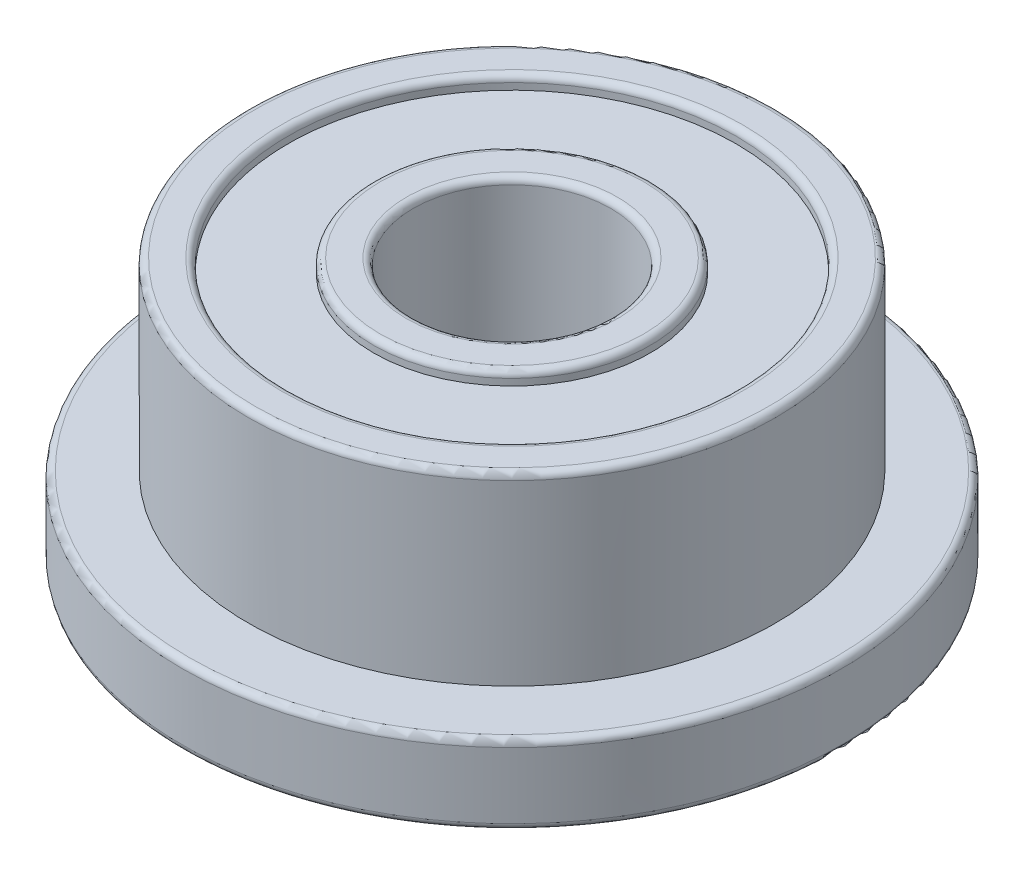
ISO-10303-21;
HEADER;
FILE_DESCRIPTION(('STEP AP214'),'2;1');
FILE_NAME('part.step','',(''),(''),'','','');
FILE_SCHEMA(('AUTOMOTIVE_DESIGN { 1 0 10303 214 1 1 1 1 }'));
ENDSEC;
DATA;
#1=APPLICATION_CONTEXT('core data for automotive mechanical design processes');
#2=APPLICATION_PROTOCOL_DEFINITION('international standard','automotive_design',2000,#1);
#3=PRODUCT_CONTEXT('',#1,'mechanical');
#4=PRODUCT('Part','Part','',(#3));
#5=PRODUCT_RELATED_PRODUCT_CATEGORY('part','',(#4));
#6=PRODUCT_DEFINITION_FORMATION('','',#4);
#7=PRODUCT_DEFINITION_CONTEXT('part definition',#1,'design');
#8=PRODUCT_DEFINITION('design','',#6,#7);
#9=PRODUCT_DEFINITION_SHAPE('','',#8);
#10=(LENGTH_UNIT() NAMED_UNIT(*) SI_UNIT(.MILLI.,.METRE.));
#11=(NAMED_UNIT(*) PLANE_ANGLE_UNIT() SI_UNIT($,.RADIAN.));
#12=(NAMED_UNIT(*) SI_UNIT($,.STERADIAN.) SOLID_ANGLE_UNIT());
#13=UNCERTAINTY_MEASURE_WITH_UNIT(LENGTH_MEASURE(1.E-05),#10,'distance_accuracy_value','');
#14=(GEOMETRIC_REPRESENTATION_CONTEXT(3) GLOBAL_UNCERTAINTY_ASSIGNED_CONTEXT((#13)) GLOBAL_UNIT_ASSIGNED_CONTEXT((#10,
#11,#12)) REPRESENTATION_CONTEXT('',''));
#15=CARTESIAN_POINT('',(0.,0.,0.));
#16=DIRECTION('',(0.,0.,1.));
#17=DIRECTION('',(1.,0.,0.));
#18=AXIS2_PLACEMENT_3D('',#15,#16,#17);
#19=CARTESIAN_POINT('',(0.,-1.1,0.));
#20=DIRECTION('',(0.,-1.,0.));
#21=DIRECTION('',(0.,0.,-1.));
#22=AXIS2_PLACEMENT_3D('',#19,#20,#21);
#23=CYLINDRICAL_SURFACE('',#22,1.05);
#24=CARTESIAN_POINT('',(0.,-0.9,0.));
#25=DIRECTION('',(0.,-1.,0.));
#26=DIRECTION('',(0.,0.,-1.));
#27=AXIS2_PLACEMENT_3D('',#24,#25,#26);
#28=CIRCLE('',#27,1.05);
#29=CARTESIAN_POINT('',(0.,-0.9,-1.05));
#30=VERTEX_POINT('',#29);
#31=EDGE_CURVE('E11',#30,#30,#28,.T.);
#32=ORIENTED_EDGE('',*,*,#31,.T.);
#33=EDGE_LOOP('',(#32));
#34=FACE_BOUND('',#33,.T.);
#35=CARTESIAN_POINT('',(0.,0.9,0.));
#36=DIRECTION('',(0.,-1.,0.));
#37=DIRECTION('',(0.,0.,-1.));
#38=AXIS2_PLACEMENT_3D('',#35,#36,#37);
#39=CIRCLE('',#38,1.05);
#40=CARTESIAN_POINT('',(0.,0.9,-1.05));
#41=VERTEX_POINT('',#40);
#42=EDGE_CURVE('E56',#41,#41,#39,.T.);
#43=ORIENTED_EDGE('',*,*,#42,.F.);
#44=EDGE_LOOP('',(#43));
#45=FACE_BOUND('',#44,.T.);
#46=ADVANCED_FACE('F42',(#34,#45),#23,.F.);
#47=CARTESIAN_POINT('',(1.05,-0.9,0.));
#48=DIRECTION('',(0.,-1.,0.));
#49=DIRECTION('',(0.,0.,-1.));
#50=AXIS2_PLACEMENT_3D('',#47,#48,#49);
#51=PLANE('',#50);
#52=CARTESIAN_POINT('',(0.,-0.9,0.));
#53=DIRECTION('',(0.,-1.,0.));
#54=DIRECTION('',(0.,0.,-1.));
#55=AXIS2_PLACEMENT_3D('',#52,#53,#54);
#56=CIRCLE('',#55,1.7);
#57=CARTESIAN_POINT('',(0.,-0.9,-1.7));
#58=VERTEX_POINT('',#57);
#59=EDGE_CURVE('E48',#58,#58,#56,.T.);
#60=ORIENTED_EDGE('',*,*,#59,.T.);
#61=EDGE_LOOP('',(#60));
#62=FACE_BOUND('',#61,.T.);
#63=ORIENTED_EDGE('',*,*,#31,.F.);
#64=EDGE_LOOP('',(#63));
#65=FACE_BOUND('',#64,.T.);
#66=ADVANCED_FACE('F66',(#62,#65),#51,.T.);
#67=CARTESIAN_POINT('',(0.,-1.1,0.));
#68=DIRECTION('',(0.,-1.,0.));
#69=DIRECTION('',(0.,0.,-1.));
#70=AXIS2_PLACEMENT_3D('',#67,#68,#69);
#71=CYLINDRICAL_SURFACE('',#70,1.7);
#72=CARTESIAN_POINT('',(0.,0.9,0.));
#73=DIRECTION('',(0.,-1.,0.));
#74=DIRECTION('',(0.,0.,-1.));
#75=AXIS2_PLACEMENT_3D('',#72,#73,#74);
#76=CIRCLE('',#75,1.7);
#77=CARTESIAN_POINT('',(0.,0.9,-1.7));
#78=VERTEX_POINT('',#77);
#79=EDGE_CURVE('E52',#78,#78,#76,.T.);
#80=ORIENTED_EDGE('',*,*,#79,.T.);
#81=EDGE_LOOP('',(#80));
#82=FACE_BOUND('',#81,.T.);
#83=ORIENTED_EDGE('',*,*,#59,.F.);
#84=EDGE_LOOP('',(#83));
#85=FACE_BOUND('',#84,.T.);
#86=ADVANCED_FACE('F70',(#82,#85),#71,.T.);
#87=CARTESIAN_POINT('',(1.05,0.9,0.));
#88=DIRECTION('',(0.,1.,0.));
#89=DIRECTION('',(0.,0.,1.));
#90=AXIS2_PLACEMENT_3D('',#87,#88,#89);
#91=PLANE('',#90);
#92=ORIENTED_EDGE('',*,*,#42,.T.);
#93=EDGE_LOOP('',(#92));
#94=FACE_BOUND('',#93,.T.);
#95=ORIENTED_EDGE('',*,*,#79,.F.);
#96=EDGE_LOOP('',(#95));
#97=FACE_BOUND('',#96,.T.);
#98=ADVANCED_FACE('F62',(#94,#97),#91,.T.);
#99=CLOSED_SHELL('',(#46,#66,#86,#98));
#100=MANIFOLD_SOLID_BREP('B2',#99);
#101=CARTESIAN_POINT('',(0.,-1.1,0.));
#102=DIRECTION('',(0.,-1.,0.));
#103=DIRECTION('',(0.,0.,-1.));
#104=AXIS2_PLACEMENT_3D('',#101,#102,#103);
#105=CYLINDRICAL_SURFACE('',#104,2.5);
#106=CARTESIAN_POINT('',(0.,-0.95,0.));
#107=DIRECTION('',(0.,-1.,0.));
#108=DIRECTION('',(0.,0.,-1.));
#109=AXIS2_PLACEMENT_3D('',#106,#107,#108);
#110=CIRCLE('',#109,2.5);
#111=CARTESIAN_POINT('',(0.,-0.95,-2.5));
#112=VERTEX_POINT('',#111);
#113=EDGE_CURVE('E137',#112,#112,#110,.F.);
#114=ORIENTED_EDGE('',*,*,#113,.T.);
#115=EDGE_LOOP('',(#114));
#116=FACE_BOUND('',#115,.T.);
#117=CARTESIAN_POINT('',(0.,-0.45,0.));
#118=DIRECTION('',(0.,1.,0.));
#119=DIRECTION('',(0.,0.,1.));
#120=AXIS2_PLACEMENT_3D('',#117,#118,#119);
#121=CIRCLE('',#120,2.5);
#122=CARTESIAN_POINT('',(0.,-0.45,2.5));
#123=VERTEX_POINT('',#122);
#124=EDGE_CURVE('E140',#123,#123,#121,.F.);
#125=ORIENTED_EDGE('',*,*,#124,.T.);
#126=EDGE_LOOP('',(#125));
#127=FACE_BOUND('',#126,.T.);
#128=ADVANCED_FACE('F111',(#116,#127),#105,.T.);
#129=CARTESIAN_POINT('',(2.5,-0.4,0.));
#130=DIRECTION('',(0.,1.,0.));
#131=DIRECTION('',(0.,0.,1.));
#132=AXIS2_PLACEMENT_3D('',#129,#130,#131);
#133=PLANE('',#132);
#134=CARTESIAN_POINT('',(0.,-0.4,0.));
#135=DIRECTION('',(0.,1.,0.));
#136=DIRECTION('',(0.,0.,1.));
#137=AXIS2_PLACEMENT_3D('',#134,#135,#136);
#138=CIRCLE('',#137,2.45);
#139=CARTESIAN_POINT('',(0.,-0.4,2.45));
#140=VERTEX_POINT('',#139);
#141=EDGE_CURVE('E134',#140,#140,#138,.T.);
#142=ORIENTED_EDGE('',*,*,#141,.T.);
#143=EDGE_LOOP('',(#142));
#144=FACE_BOUND('',#143,.T.);
#145=CARTESIAN_POINT('',(0.,-0.4,0.));
#146=DIRECTION('',(0.,-1.,0.));
#147=DIRECTION('',(0.,0.,-1.));
#148=AXIS2_PLACEMENT_3D('',#145,#146,#147);
#149=CIRCLE('',#148,2.);
#150=CARTESIAN_POINT('',(0.,-0.4,-2.));
#151=VERTEX_POINT('',#150);
#152=EDGE_CURVE('E149',#151,#151,#149,.T.);
#153=ORIENTED_EDGE('',*,*,#152,.T.);
#154=EDGE_LOOP('',(#153));
#155=FACE_BOUND('',#154,.T.);
#156=ADVANCED_FACE('F153',(#144,#155),#133,.T.);
#157=CARTESIAN_POINT('',(0.,-1.1,0.));
#158=DIRECTION('',(0.,-1.,0.));
#159=DIRECTION('',(0.,0.,-1.));
#160=AXIS2_PLACEMENT_3D('',#157,#158,#159);
#161=CYLINDRICAL_SURFACE('',#160,2.);
#162=CARTESIAN_POINT('',(0.,0.950000000000001,0.));
#163=DIRECTION('',(0.,1.,0.));
#164=DIRECTION('',(0.,0.,1.));
#165=AXIS2_PLACEMENT_3D('',#162,#163,#164);
#166=CIRCLE('',#165,2.);
#167=CARTESIAN_POINT('',(0.,0.950000000000001,2.));
#168=VERTEX_POINT('',#167);
#169=EDGE_CURVE('E41',#168,#168,#166,.F.);
#170=ORIENTED_EDGE('',*,*,#169,.T.);
#171=EDGE_LOOP('',(#170));
#172=FACE_BOUND('',#171,.T.);
#173=ORIENTED_EDGE('',*,*,#152,.F.);
#174=EDGE_LOOP('',(#173));
#175=FACE_BOUND('',#174,.T.);
#176=ADVANCED_FACE('F155',(#172,#175),#161,.T.);
#177=CARTESIAN_POINT('',(2.,1.,0.));
#178=DIRECTION('',(0.,1.,0.));
#179=DIRECTION('',(0.,0.,1.));
#180=AXIS2_PLACEMENT_3D('',#177,#178,#179);
#181=PLANE('',#180);
#182=CARTESIAN_POINT('',(0.,1.,0.));
#183=DIRECTION('',(0.,1.,0.));
#184=DIRECTION('',(0.,0.,1.));
#185=AXIS2_PLACEMENT_3D('',#182,#183,#184);
#186=CIRCLE('',#185,1.75);
#187=CARTESIAN_POINT('',(0.,1.,1.75));
#188=VERTEX_POINT('',#187);
#189=EDGE_CURVE('E118',#188,#188,#186,.F.);
#190=ORIENTED_EDGE('',*,*,#189,.T.);
#191=EDGE_LOOP('',(#190));
#192=FACE_BOUND('',#191,.T.);
#193=CARTESIAN_POINT('',(0.,1.,0.));
#194=DIRECTION('',(0.,1.,0.));
#195=DIRECTION('',(0.,0.,1.));
#196=AXIS2_PLACEMENT_3D('',#193,#194,#195);
#197=CIRCLE('',#196,1.95);
#198=CARTESIAN_POINT('',(0.,1.,1.95));
#199=VERTEX_POINT('',#198);
#200=EDGE_CURVE('E122',#199,#199,#197,.T.);
#201=ORIENTED_EDGE('',*,*,#200,.T.);
#202=EDGE_LOOP('',(#201));
#203=FACE_BOUND('',#202,.T.);
#204=ADVANCED_FACE('F157',(#192,#203),#181,.T.);
#205=CARTESIAN_POINT('',(0.,-1.1,0.));
#206=DIRECTION('',(0.,-1.,0.));
#207=DIRECTION('',(0.,0.,-1.));
#208=AXIS2_PLACEMENT_3D('',#205,#206,#207);
#209=CYLINDRICAL_SURFACE('',#208,1.7);
#210=CARTESIAN_POINT('',(0.,-0.95,0.));
#211=DIRECTION('',(0.,-1.,0.));
#212=DIRECTION('',(0.,0.,-1.));
#213=AXIS2_PLACEMENT_3D('',#210,#211,#212);
#214=CIRCLE('',#213,1.7);
#215=CARTESIAN_POINT('',(0.,-0.95,-1.7));
#216=VERTEX_POINT('',#215);
#217=EDGE_CURVE('E126',#216,#216,#214,.T.);
#218=ORIENTED_EDGE('',*,*,#217,.T.);
#219=EDGE_LOOP('',(#218));
#220=FACE_BOUND('',#219,.T.);
#221=CARTESIAN_POINT('',(0.,0.950000000000001,0.));
#222=DIRECTION('',(0.,1.,0.));
#223=DIRECTION('',(0.,0.,1.));
#224=AXIS2_PLACEMENT_3D('',#221,#222,#223);
#225=CIRCLE('',#224,1.7);
#226=CARTESIAN_POINT('',(0.,0.950000000000001,1.7));
#227=VERTEX_POINT('',#226);
#228=EDGE_CURVE('E131',#227,#227,#225,.T.);
#229=ORIENTED_EDGE('',*,*,#228,.T.);
#230=EDGE_LOOP('',(#229));
#231=FACE_BOUND('',#230,.T.);
#232=ADVANCED_FACE('F163',(#220,#231),#209,.F.);
#233=CARTESIAN_POINT('',(1.7,-1.,0.));
#234=DIRECTION('',(0.,-1.,0.));
#235=DIRECTION('',(0.,0.,-1.));
#236=AXIS2_PLACEMENT_3D('',#233,#234,#235);
#237=PLANE('',#236);
#238=CARTESIAN_POINT('',(0.,-1.,0.));
#239=DIRECTION('',(0.,-1.,0.));
#240=DIRECTION('',(0.,0.,-1.));
#241=AXIS2_PLACEMENT_3D('',#238,#239,#240);
#242=CIRCLE('',#241,2.45);
#243=CARTESIAN_POINT('',(0.,-1.,-2.45));
#244=VERTEX_POINT('',#243);
#245=EDGE_CURVE('E143',#244,#244,#242,.T.);
#246=ORIENTED_EDGE('',*,*,#245,.T.);
#247=EDGE_LOOP('',(#246));
#248=FACE_BOUND('',#247,.T.);
#249=CARTESIAN_POINT('',(0.,-1.,0.));
#250=DIRECTION('',(0.,-1.,0.));
#251=DIRECTION('',(0.,0.,-1.));
#252=AXIS2_PLACEMENT_3D('',#249,#250,#251);
#253=CIRCLE('',#252,1.75);
#254=CARTESIAN_POINT('',(0.,-1.,-1.75));
#255=VERTEX_POINT('',#254);
#256=EDGE_CURVE('E146',#255,#255,#253,.F.);
#257=ORIENTED_EDGE('',*,*,#256,.T.);
#258=EDGE_LOOP('',(#257));
#259=FACE_BOUND('',#258,.T.);
#260=ADVANCED_FACE('F178',(#248,#259),#237,.T.);
#261=CARTESIAN_POINT('',(0.,-0.95,0.));
#262=DIRECTION('',(0.,-1.,0.));
#263=DIRECTION('',(0.,0.,-1.));
#264=AXIS2_PLACEMENT_3D('',#261,#262,#263);
#265=TOROIDAL_SURFACE('',#264,2.45,0.05);
#266=ORIENTED_EDGE('',*,*,#113,.F.);
#267=EDGE_LOOP('',(#266));
#268=FACE_BOUND('',#267,.T.);
#269=ORIENTED_EDGE('',*,*,#245,.F.);
#270=EDGE_LOOP('',(#269));
#271=FACE_BOUND('',#270,.T.);
#272=ADVANCED_FACE('F174',(#268,#271),#265,.T.);
#273=CARTESIAN_POINT('',(0.,-0.45,0.));
#274=DIRECTION('',(0.,1.,0.));
#275=DIRECTION('',(0.,0.,1.));
#276=AXIS2_PLACEMENT_3D('',#273,#274,#275);
#277=TOROIDAL_SURFACE('',#276,2.45,0.05);
#278=ORIENTED_EDGE('',*,*,#141,.F.);
#279=EDGE_LOOP('',(#278));
#280=FACE_BOUND('',#279,.T.);
#281=ORIENTED_EDGE('',*,*,#124,.F.);
#282=EDGE_LOOP('',(#281));
#283=FACE_BOUND('',#282,.T.);
#284=ADVANCED_FACE('F177',(#280,#283),#277,.T.);
#285=CARTESIAN_POINT('',(0.,-0.95,0.));
#286=DIRECTION('',(0.,-1.,0.));
#287=DIRECTION('',(0.,0.,-1.));
#288=AXIS2_PLACEMENT_3D('',#285,#286,#287);
#289=TOROIDAL_SURFACE('',#288,1.75,0.05);
#290=ORIENTED_EDGE('',*,*,#256,.F.);
#291=EDGE_LOOP('',(#290));
#292=FACE_BOUND('',#291,.T.);
#293=ORIENTED_EDGE('',*,*,#217,.F.);
#294=EDGE_LOOP('',(#293));
#295=FACE_BOUND('',#294,.T.);
#296=ADVANCED_FACE('F182',(#292,#295),#289,.T.);
#297=CARTESIAN_POINT('',(0.,0.950000000000001,0.));
#298=DIRECTION('',(0.,1.,0.));
#299=DIRECTION('',(0.,0.,1.));
#300=AXIS2_PLACEMENT_3D('',#297,#298,#299);
#301=TOROIDAL_SURFACE('',#300,1.75,0.05);
#302=ORIENTED_EDGE('',*,*,#228,.F.);
#303=EDGE_LOOP('',(#302));
#304=FACE_BOUND('',#303,.T.);
#305=ORIENTED_EDGE('',*,*,#189,.F.);
#306=EDGE_LOOP('',(#305));
#307=FACE_BOUND('',#306,.T.);
#308=ADVANCED_FACE('F185',(#304,#307),#301,.T.);
#309=CARTESIAN_POINT('',(0.,0.950000000000001,0.));
#310=DIRECTION('',(0.,1.,0.));
#311=DIRECTION('',(0.,0.,1.));
#312=AXIS2_PLACEMENT_3D('',#309,#310,#311);
#313=TOROIDAL_SURFACE('',#312,1.95,0.05);
#314=ORIENTED_EDGE('',*,*,#200,.F.);
#315=EDGE_LOOP('',(#314));
#316=FACE_BOUND('',#315,.T.);
#317=ORIENTED_EDGE('',*,*,#169,.F.);
#318=EDGE_LOOP('',(#317));
#319=FACE_BOUND('',#318,.T.);
#320=ADVANCED_FACE('F113',(#316,#319),#313,.T.);
#321=CLOSED_SHELL('',(#128,#156,#176,#204,#232,#260,#272,#284,#296,#308,#320));
#322=MANIFOLD_SOLID_BREP('B6',#321);
#323=CARTESIAN_POINT('',(0.,-1.1,0.));
#324=DIRECTION('',(0.,-1.,0.));
#325=DIRECTION('',(0.,0.,-1.));
#326=AXIS2_PLACEMENT_3D('',#323,#324,#325);
#327=CYLINDRICAL_SURFACE('',#326,0.75);
#328=CARTESIAN_POINT('',(0.,-0.95,0.));
#329=DIRECTION('',(0.,-1.,0.));
#330=DIRECTION('',(0.,0.,-1.));
#331=AXIS2_PLACEMENT_3D('',#328,#329,#330);
#332=CIRCLE('',#331,0.75);
#333=CARTESIAN_POINT('',(0.,-0.95,-0.75));
#334=VERTEX_POINT('',#333);
#335=EDGE_CURVE('E304',#334,#334,#332,.T.);
#336=ORIENTED_EDGE('',*,*,#335,.T.);
#337=EDGE_LOOP('',(#336));
#338=FACE_BOUND('',#337,.T.);
#339=CARTESIAN_POINT('',(0.,0.95,0.));
#340=DIRECTION('',(0.,1.,0.));
#341=DIRECTION('',(0.,0.,1.));
#342=AXIS2_PLACEMENT_3D('',#339,#340,#341);
#343=CIRCLE('',#342,0.75);
#344=CARTESIAN_POINT('',(0.,0.95,0.75));
#345=VERTEX_POINT('',#344);
#346=EDGE_CURVE('E307',#345,#345,#343,.T.);
#347=ORIENTED_EDGE('',*,*,#346,.T.);
#348=EDGE_LOOP('',(#347));
#349=FACE_BOUND('',#348,.T.);
#350=ADVANCED_FACE('F278',(#338,#349),#327,.F.);
#351=CARTESIAN_POINT('',(0.75,-1.,0.));
#352=DIRECTION('',(0.,-1.,0.));
#353=DIRECTION('',(0.,0.,-1.));
#354=AXIS2_PLACEMENT_3D('',#351,#352,#353);
#355=PLANE('',#354);
#356=CARTESIAN_POINT('',(0.,-1.,0.));
#357=DIRECTION('',(0.,-1.,0.));
#358=DIRECTION('',(0.,0.,-1.));
#359=AXIS2_PLACEMENT_3D('',#356,#357,#358);
#360=CIRCLE('',#359,0.8);
#361=CARTESIAN_POINT('',(0.,-1.,-0.8));
#362=VERTEX_POINT('',#361);
#363=EDGE_CURVE('E298',#362,#362,#360,.F.);
#364=ORIENTED_EDGE('',*,*,#363,.T.);
#365=EDGE_LOOP('',(#364));
#366=FACE_BOUND('',#365,.T.);
#367=CARTESIAN_POINT('',(0.,-1.,0.));
#368=DIRECTION('',(0.,-1.,0.));
#369=DIRECTION('',(0.,0.,-1.));
#370=AXIS2_PLACEMENT_3D('',#367,#368,#369);
#371=CIRCLE('',#370,1.);
#372=CARTESIAN_POINT('',(0.,-1.,-1.));
#373=VERTEX_POINT('',#372);
#374=EDGE_CURVE('E301',#373,#373,#371,.T.);
#375=ORIENTED_EDGE('',*,*,#374,.T.);
#376=EDGE_LOOP('',(#375));
#377=FACE_BOUND('',#376,.T.);
#378=ADVANCED_FACE('F321',(#366,#377),#355,.T.);
#379=CARTESIAN_POINT('',(0.,-1.1,0.));
#380=DIRECTION('',(0.,-1.,0.));
#381=DIRECTION('',(0.,0.,-1.));
#382=AXIS2_PLACEMENT_3D('',#379,#380,#381);
#383=CYLINDRICAL_SURFACE('',#382,1.05);
#384=CARTESIAN_POINT('',(0.,-0.95,0.));
#385=DIRECTION('',(0.,-1.,0.));
#386=DIRECTION('',(0.,0.,-1.));
#387=AXIS2_PLACEMENT_3D('',#384,#385,#386);
#388=CIRCLE('',#387,1.05);
#389=CARTESIAN_POINT('',(0.,-0.95,-1.05));
#390=VERTEX_POINT('',#389);
#391=EDGE_CURVE('E289',#390,#390,#388,.F.);
#392=ORIENTED_EDGE('',*,*,#391,.T.);
#393=EDGE_LOOP('',(#392));
#394=FACE_BOUND('',#393,.T.);
#395=CARTESIAN_POINT('',(0.,0.95,0.));
#396=DIRECTION('',(0.,1.,0.));
#397=DIRECTION('',(0.,0.,1.));
#398=AXIS2_PLACEMENT_3D('',#395,#396,#397);
#399=CIRCLE('',#398,1.05);
#400=CARTESIAN_POINT('',(0.,0.95,1.05));
#401=VERTEX_POINT('',#400);
#402=EDGE_CURVE('E293',#401,#401,#399,.F.);
#403=ORIENTED_EDGE('',*,*,#402,.T.);
#404=EDGE_LOOP('',(#403));
#405=FACE_BOUND('',#404,.T.);
#406=ADVANCED_FACE('F327',(#394,#405),#383,.T.);
#407=CARTESIAN_POINT('',(0.75,1.,0.));
#408=DIRECTION('',(0.,1.,0.));
#409=DIRECTION('',(0.,0.,1.));
#410=AXIS2_PLACEMENT_3D('',#407,#408,#409);
#411=PLANE('',#410);
#412=CARTESIAN_POINT('',(0.,1.,0.));
#413=DIRECTION('',(0.,1.,0.));
#414=DIRECTION('',(0.,0.,1.));
#415=AXIS2_PLACEMENT_3D('',#412,#413,#414);
#416=CIRCLE('',#415,1.);
#417=CARTESIAN_POINT('',(0.,1.,1.));
#418=VERTEX_POINT('',#417);
#419=EDGE_CURVE('E110',#418,#418,#416,.T.);
#420=ORIENTED_EDGE('',*,*,#419,.T.);
#421=EDGE_LOOP('',(#420));
#422=FACE_BOUND('',#421,.T.);
#423=CARTESIAN_POINT('',(0.,1.,0.));
#424=DIRECTION('',(0.,1.,0.));
#425=DIRECTION('',(0.,0.,1.));
#426=AXIS2_PLACEMENT_3D('',#423,#424,#425);
#427=CIRCLE('',#426,0.8);
#428=CARTESIAN_POINT('',(0.,1.,0.8));
#429=VERTEX_POINT('',#428);
#430=EDGE_CURVE('E285',#429,#429,#427,.F.);
#431=ORIENTED_EDGE('',*,*,#430,.T.);
#432=EDGE_LOOP('',(#431));
#433=FACE_BOUND('',#432,.T.);
#434=ADVANCED_FACE('F335',(#422,#433),#411,.T.);
#435=CARTESIAN_POINT('',(0.,-0.95,0.));
#436=DIRECTION('',(0.,-1.,0.));
#437=DIRECTION('',(0.,0.,-1.));
#438=AXIS2_PLACEMENT_3D('',#435,#436,#437);
#439=TOROIDAL_SURFACE('',#438,0.8,0.05);
#440=ORIENTED_EDGE('',*,*,#363,.F.);
#441=EDGE_LOOP('',(#440));
#442=FACE_BOUND('',#441,.T.);
#443=ORIENTED_EDGE('',*,*,#335,.F.);
#444=EDGE_LOOP('',(#443));
#445=FACE_BOUND('',#444,.T.);
#446=ADVANCED_FACE('F332',(#442,#445),#439,.T.);
#447=CARTESIAN_POINT('',(0.,-0.95,0.));
#448=DIRECTION('',(0.,-1.,0.));
#449=DIRECTION('',(0.,0.,-1.));
#450=AXIS2_PLACEMENT_3D('',#447,#448,#449);
#451=TOROIDAL_SURFACE('',#450,1.,0.05);
#452=ORIENTED_EDGE('',*,*,#391,.F.);
#453=EDGE_LOOP('',(#452));
#454=FACE_BOUND('',#453,.T.);
#455=ORIENTED_EDGE('',*,*,#374,.F.);
#456=EDGE_LOOP('',(#455));
#457=FACE_BOUND('',#456,.T.);
#458=ADVANCED_FACE('F318',(#454,#457),#451,.T.);
#459=CARTESIAN_POINT('',(0.,0.95,0.));
#460=DIRECTION('',(0.,1.,0.));
#461=DIRECTION('',(0.,0.,1.));
#462=AXIS2_PLACEMENT_3D('',#459,#460,#461);
#463=TOROIDAL_SURFACE('',#462,1.,0.05);
#464=ORIENTED_EDGE('',*,*,#419,.F.);
#465=EDGE_LOOP('',(#464));
#466=FACE_BOUND('',#465,.T.);
#467=ORIENTED_EDGE('',*,*,#402,.F.);
#468=EDGE_LOOP('',(#467));
#469=FACE_BOUND('',#468,.T.);
#470=ADVANCED_FACE('F314',(#466,#469),#463,.T.);
#471=CARTESIAN_POINT('',(0.,0.95,0.));
#472=DIRECTION('',(0.,1.,0.));
#473=DIRECTION('',(0.,0.,1.));
#474=AXIS2_PLACEMENT_3D('',#471,#472,#473);
#475=TOROIDAL_SURFACE('',#474,0.8,0.05);
#476=ORIENTED_EDGE('',*,*,#346,.F.);
#477=EDGE_LOOP('',(#476));
#478=FACE_BOUND('',#477,.T.);
#479=ORIENTED_EDGE('',*,*,#430,.F.);
#480=EDGE_LOOP('',(#479));
#481=FACE_BOUND('',#480,.T.);
#482=ADVANCED_FACE('F280',(#478,#481),#475,.T.);
#483=CLOSED_SHELL('',(#350,#378,#406,#434,#446,#458,#470,#482));
#484=MANIFOLD_SOLID_BREP('B36',#483);
#485=ADVANCED_BREP_SHAPE_REPRESENTATION('',(#18,#100,#322,#484),#14);
#486=SHAPE_DEFINITION_REPRESENTATION(#9,#485);
ENDSEC;
END-ISO-10303-21;
